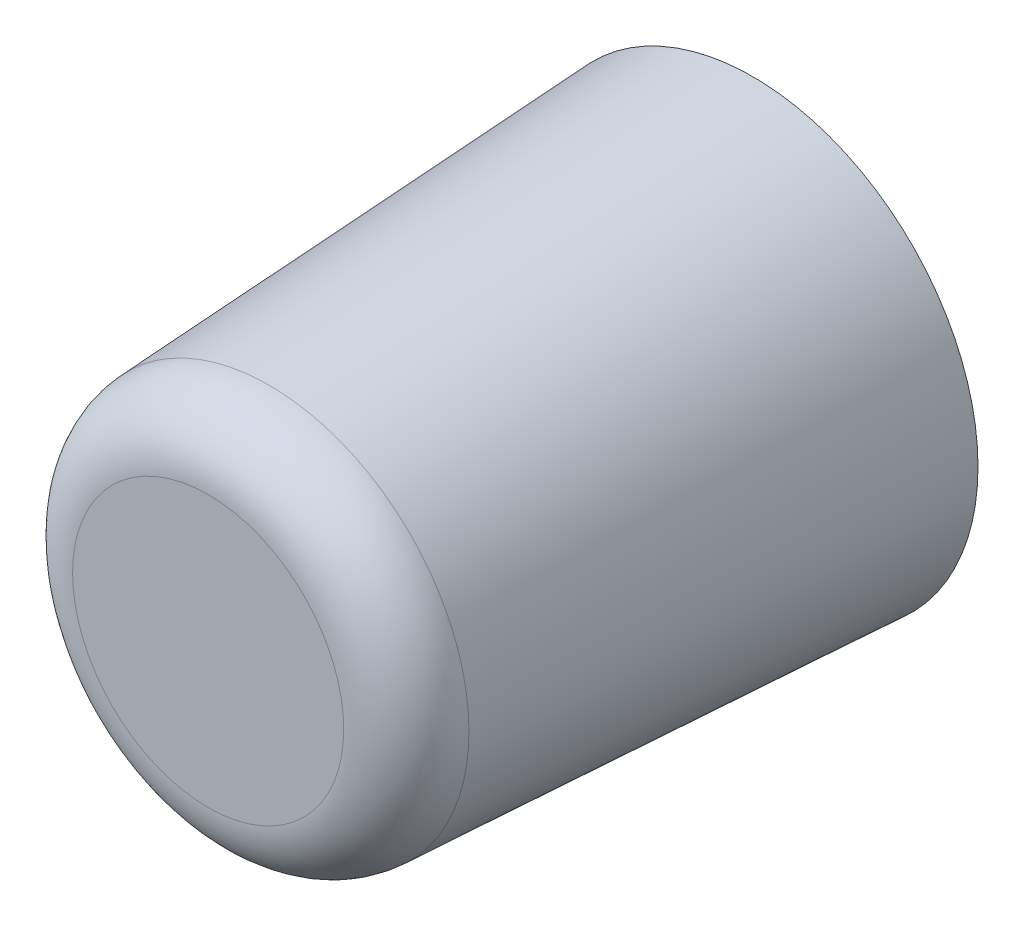
ISO-10303-21;
HEADER;
FILE_DESCRIPTION(('STEP AP214'),'2;1');
FILE_NAME('part.step','',(''),(''),'','','');
FILE_SCHEMA(('AUTOMOTIVE_DESIGN { 1 0 10303 214 1 1 1 1 }'));
ENDSEC;
DATA;
#1=APPLICATION_CONTEXT('core data for automotive mechanical design processes');
#2=APPLICATION_PROTOCOL_DEFINITION('international standard','automotive_design',2000,#1);
#3=PRODUCT_CONTEXT('',#1,'mechanical');
#4=PRODUCT('Part','Part','',(#3));
#5=PRODUCT_RELATED_PRODUCT_CATEGORY('part','',(#4));
#6=PRODUCT_DEFINITION_FORMATION('','',#4);
#7=PRODUCT_DEFINITION_CONTEXT('part definition',#1,'design');
#8=PRODUCT_DEFINITION('design','',#6,#7);
#9=PRODUCT_DEFINITION_SHAPE('','',#8);
#10=(LENGTH_UNIT() NAMED_UNIT(*) SI_UNIT(.MILLI.,.METRE.));
#11=(NAMED_UNIT(*) PLANE_ANGLE_UNIT() SI_UNIT($,.RADIAN.));
#12=(NAMED_UNIT(*) SI_UNIT($,.STERADIAN.) SOLID_ANGLE_UNIT());
#13=UNCERTAINTY_MEASURE_WITH_UNIT(LENGTH_MEASURE(1.E-05),#10,'distance_accuracy_value','');
#14=(GEOMETRIC_REPRESENTATION_CONTEXT(3) GLOBAL_UNCERTAINTY_ASSIGNED_CONTEXT((#13)) GLOBAL_UNIT_ASSIGNED_CONTEXT((#10,
#11,#12)) REPRESENTATION_CONTEXT('',''));
#15=CARTESIAN_POINT('',(0.,0.,0.));
#16=DIRECTION('',(0.,0.,1.));
#17=DIRECTION('',(1.,0.,0.));
#18=AXIS2_PLACEMENT_3D('',#15,#16,#17);
#19=CARTESIAN_POINT('',(0.,0.,0.));
#20=DIRECTION('',(0.,0.,-1.));
#21=DIRECTION('',(1.,0.,0.));
#22=AXIS2_PLACEMENT_3D('',#19,#20,#21);
#23=CONICAL_SURFACE('',#22,10.5,0.0523598775598299);
#24=CARTESIAN_POINT('',(0.,0.,22.5570078687288));
#25=DIRECTION('',(0.,0.,-1.));
#26=DIRECTION('',(-1.,0.,0.));
#27=AXIS2_PLACEMENT_3D('',#24,#25,#26);
#28=CIRCLE('',#27,9.31783731032984);
#29=CARTESIAN_POINT('',(-9.31783731032984,0.,22.5570078687288));
#30=VERTEX_POINT('',#29);
#31=EDGE_CURVE('E10',#30,#30,#28,.T.);
#32=ORIENTED_EDGE('',*,*,#31,.T.);
#33=EDGE_LOOP('',(#32));
#34=FACE_BOUND('',#33,.T.);
#35=CARTESIAN_POINT('',(0.,0.,0.));
#36=DIRECTION('',(0.,0.,1.));
#37=DIRECTION('',(1.,0.,0.));
#38=AXIS2_PLACEMENT_3D('',#35,#36,#37);
#39=CIRCLE('',#38,10.5);
#40=CARTESIAN_POINT('',(10.5,0.,0.));
#41=VERTEX_POINT('',#40);
#42=EDGE_CURVE('E42',#41,#41,#39,.T.);
#43=ORIENTED_EDGE('',*,*,#42,.T.);
#44=EDGE_LOOP('',(#43));
#45=FACE_BOUND('',#44,.T.);
#46=ADVANCED_FACE('F31',(#34,#45),#23,.T.);
#47=CARTESIAN_POINT('',(0.,0.,25.4));
#48=DIRECTION('',(0.,0.,1.));
#49=DIRECTION('',(1.,0.,0.));
#50=AXIS2_PLACEMENT_3D('',#47,#48,#49);
#51=PLANE('',#50);
#52=CARTESIAN_POINT('',(0.,0.,25.4));
#53=DIRECTION('',(0.,0.,1.));
#54=DIRECTION('',(1.,0.,0.));
#55=AXIS2_PLACEMENT_3D('',#52,#53,#54);
#56=CIRCLE('',#55,6.32194870606611);
#57=CARTESIAN_POINT('',(6.32194870606611,0.,25.4));
#58=VERTEX_POINT('',#57);
#59=EDGE_CURVE('E38',#58,#58,#56,.T.);
#60=ORIENTED_EDGE('',*,*,#59,.T.);
#61=EDGE_LOOP('',(#60));
#62=FACE_BOUND('',#61,.T.);
#63=ADVANCED_FACE('F52',(#62),#51,.T.);
#64=CARTESIAN_POINT('',(0.,0.,0.));
#65=DIRECTION('',(0.,0.,1.));
#66=DIRECTION('',(1.,0.,0.));
#67=AXIS2_PLACEMENT_3D('',#64,#65,#66);
#68=PLANE('',#67);
#69=ORIENTED_EDGE('',*,*,#42,.F.);
#70=EDGE_LOOP('',(#69));
#71=FACE_BOUND('',#70,.T.);
#72=ADVANCED_FACE('F50',(#71),#68,.F.);
#73=CARTESIAN_POINT('',(0.,0.,22.4));
#74=DIRECTION('',(0.,0.,1.));
#75=DIRECTION('',(1.,0.,0.));
#76=AXIS2_PLACEMENT_3D('',#73,#74,#75);
#77=TOROIDAL_SURFACE('',#76,6.32194870606611,3.);
#78=ORIENTED_EDGE('',*,*,#31,.F.);
#79=EDGE_LOOP('',(#78));
#80=FACE_BOUND('',#79,.T.);
#81=ORIENTED_EDGE('',*,*,#59,.F.);
#82=EDGE_LOOP('',(#81));
#83=FACE_BOUND('',#82,.T.);
#84=ADVANCED_FACE('F33',(#80,#83),#77,.T.);
#85=CLOSED_SHELL('',(#46,#63,#72,#84));
#86=MANIFOLD_SOLID_BREP('B2',#85);
#87=ADVANCED_BREP_SHAPE_REPRESENTATION('',(#18,#86),#14);
#88=SHAPE_DEFINITION_REPRESENTATION(#9,#87);
ENDSEC;
END-ISO-10303-21;
